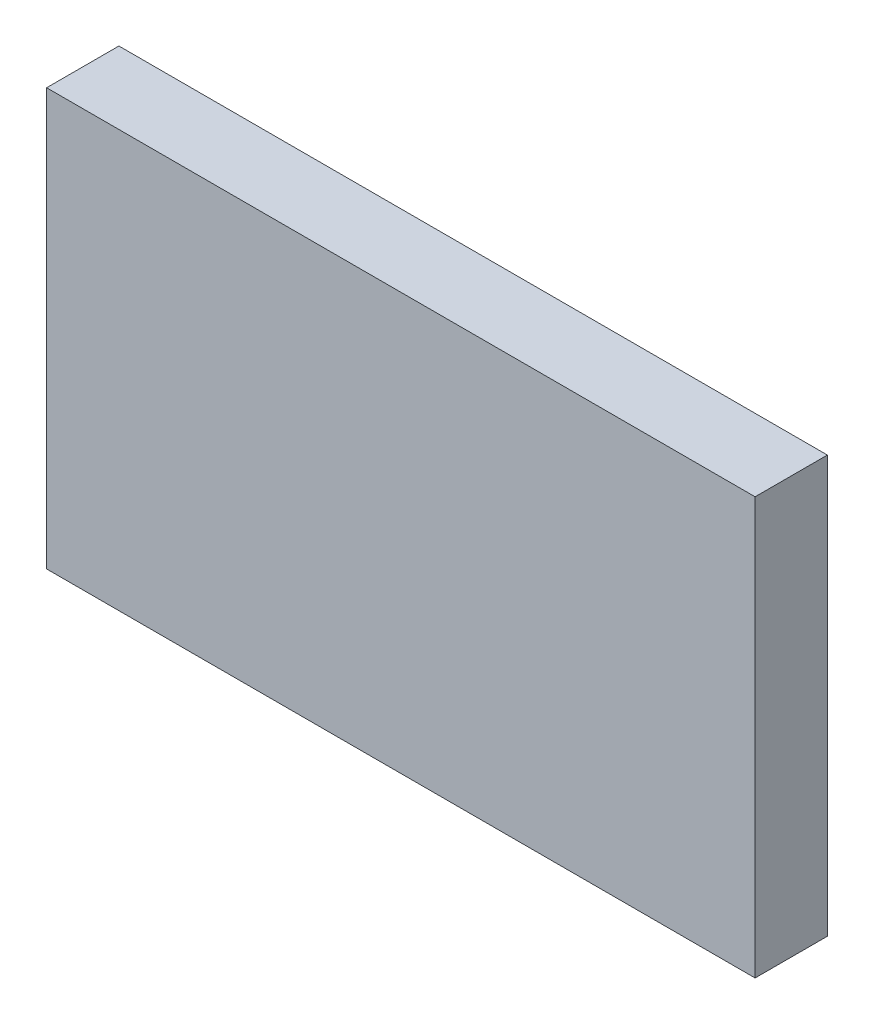
ISO-10303-21;
HEADER;
FILE_DESCRIPTION(('STEP AP214'),'2;1');
FILE_NAME('part.step','',(''),(''),'','','');
FILE_SCHEMA(('AUTOMOTIVE_DESIGN { 1 0 10303 214 1 1 1 1 }'));
ENDSEC;
DATA;
#1=APPLICATION_CONTEXT('core data for automotive mechanical design processes');
#2=APPLICATION_PROTOCOL_DEFINITION('international standard','automotive_design',2000,#1);
#3=PRODUCT_CONTEXT('',#1,'mechanical');
#4=PRODUCT('Part','Part','',(#3));
#5=PRODUCT_RELATED_PRODUCT_CATEGORY('part','',(#4));
#6=PRODUCT_DEFINITION_FORMATION('','',#4);
#7=PRODUCT_DEFINITION_CONTEXT('part definition',#1,'design');
#8=PRODUCT_DEFINITION('design','',#6,#7);
#9=PRODUCT_DEFINITION_SHAPE('','',#8);
#10=(LENGTH_UNIT() NAMED_UNIT(*) SI_UNIT(.MILLI.,.METRE.));
#11=(NAMED_UNIT(*) PLANE_ANGLE_UNIT() SI_UNIT($,.RADIAN.));
#12=(NAMED_UNIT(*) SI_UNIT($,.STERADIAN.) SOLID_ANGLE_UNIT());
#13=UNCERTAINTY_MEASURE_WITH_UNIT(LENGTH_MEASURE(1.E-05),#10,'distance_accuracy_value','');
#14=(GEOMETRIC_REPRESENTATION_CONTEXT(3) GLOBAL_UNCERTAINTY_ASSIGNED_CONTEXT((#13)) GLOBAL_UNIT_ASSIGNED_CONTEXT((#10,
#11,#12)) REPRESENTATION_CONTEXT('',''));
#15=CARTESIAN_POINT('',(0.,0.,0.));
#16=DIRECTION('',(0.,0.,1.));
#17=DIRECTION('',(1.,0.,0.));
#18=AXIS2_PLACEMENT_3D('',#15,#16,#17);
#19=CARTESIAN_POINT('',(-7.12169539547727,60.364846685474,10.));
#20=DIRECTION('',(-1.,0.,0.));
#21=DIRECTION('',(0.,0.,1.));
#22=AXIS2_PLACEMENT_3D('',#19,#20,#21);
#23=PLANE('',#22);
#24=DIRECTION('',(0.,1.,0.));
#25=VECTOR('',#24,1.);
#26=CARTESIAN_POINT('',(-7.12169539547727,60.364846685474,0.));
#27=LINE('',#26,#25);
#28=CARTESIAN_POINT('',(-7.12169539547727,2.71302681732467,0.));
#29=VERTEX_POINT('',#28);
#30=CARTESIAN_POINT('',(-7.12169539547727,60.364846685474,0.));
#31=VERTEX_POINT('',#30);
#32=EDGE_CURVE('E98',#29,#31,#27,.T.);
#33=ORIENTED_EDGE('',*,*,#32,.T.);
#34=DIRECTION('',(0.,0.,-1.));
#35=VECTOR('',#34,1.);
#36=CARTESIAN_POINT('',(-7.12169539547727,60.364846685474,10.));
#37=LINE('',#36,#35);
#38=CARTESIAN_POINT('',(-7.12169539547727,60.364846685474,10.));
#39=VERTEX_POINT('',#38);
#40=EDGE_CURVE('E11',#39,#31,#37,.T.);
#41=ORIENTED_EDGE('',*,*,#40,.F.);
#42=DIRECTION('',(0.,1.,0.));
#43=VECTOR('',#42,1.);
#44=CARTESIAN_POINT('',(-7.12169539547727,60.364846685474,10.));
#45=LINE('',#44,#43);
#46=CARTESIAN_POINT('',(-7.12169539547727,2.71302681732467,10.));
#47=VERTEX_POINT('',#46);
#48=EDGE_CURVE('E86',#47,#39,#45,.T.);
#49=ORIENTED_EDGE('',*,*,#48,.F.);
#50=DIRECTION('',(0.,0.,-1.));
#51=VECTOR('',#50,1.);
#52=CARTESIAN_POINT('',(-7.12169539547727,2.71302681732467,10.));
#53=LINE('',#52,#51);
#54=EDGE_CURVE('E94',#47,#29,#53,.T.);
#55=ORIENTED_EDGE('',*,*,#54,.T.);
#56=EDGE_LOOP('',(#33,#41,#49,#55));
#57=FACE_BOUND('',#56,.T.);
#58=ADVANCED_FACE('F35',(#57),#23,.F.);
#59=CARTESIAN_POINT('',(-105.129789171331,60.364846685474,10.));
#60=DIRECTION('',(0.,-1.,0.));
#61=DIRECTION('',(0.,0.,-1.));
#62=AXIS2_PLACEMENT_3D('',#59,#60,#61);
#63=PLANE('',#62);
#64=DIRECTION('',(-1.,0.,0.));
#65=VECTOR('',#64,1.);
#66=CARTESIAN_POINT('',(-105.129789171331,60.364846685474,0.));
#67=LINE('',#66,#65);
#68=CARTESIAN_POINT('',(-105.129789171331,60.364846685474,0.));
#69=VERTEX_POINT('',#68);
#70=EDGE_CURVE('E90',#31,#69,#67,.T.);
#71=ORIENTED_EDGE('',*,*,#70,.T.);
#72=DIRECTION('',(0.,0.,-1.));
#73=VECTOR('',#72,1.);
#74=CARTESIAN_POINT('',(-105.129789171331,60.364846685474,10.));
#75=LINE('',#74,#73);
#76=CARTESIAN_POINT('',(-105.129789171331,60.364846685474,10.));
#77=VERTEX_POINT('',#76);
#78=EDGE_CURVE('E43',#77,#69,#75,.T.);
#79=ORIENTED_EDGE('',*,*,#78,.F.);
#80=DIRECTION('',(-1.,0.,0.));
#81=VECTOR('',#80,1.);
#82=CARTESIAN_POINT('',(-105.129789171331,60.364846685474,10.));
#83=LINE('',#82,#81);
#84=EDGE_CURVE('E81',#39,#77,#83,.T.);
#85=ORIENTED_EDGE('',*,*,#84,.F.);
#86=ORIENTED_EDGE('',*,*,#40,.T.);
#87=EDGE_LOOP('',(#71,#79,#85,#86));
#88=FACE_BOUND('',#87,.T.);
#89=ADVANCED_FACE('F89',(#88),#63,.F.);
#90=CARTESIAN_POINT('',(-105.129789171331,60.364846685474,10.));
#91=DIRECTION('',(1.,0.,0.));
#92=DIRECTION('',(0.,0.,-1.));
#93=AXIS2_PLACEMENT_3D('',#90,#91,#92);
#94=PLANE('',#93);
#95=DIRECTION('',(0.,-1.,0.));
#96=VECTOR('',#95,1.);
#97=CARTESIAN_POINT('',(-105.129789171331,60.364846685474,0.));
#98=LINE('',#97,#96);
#99=CARTESIAN_POINT('',(-105.129789171331,2.71302681732467,0.));
#100=VERTEX_POINT('',#99);
#101=EDGE_CURVE('E68',#69,#100,#98,.T.);
#102=ORIENTED_EDGE('',*,*,#101,.T.);
#103=DIRECTION('',(0.,0.,-1.));
#104=VECTOR('',#103,1.);
#105=CARTESIAN_POINT('',(-105.129789171331,2.71302681732467,10.));
#106=LINE('',#105,#104);
#107=CARTESIAN_POINT('',(-105.129789171331,2.71302681732467,10.));
#108=VERTEX_POINT('',#107);
#109=EDGE_CURVE('E91',#108,#100,#106,.T.);
#110=ORIENTED_EDGE('',*,*,#109,.F.);
#111=DIRECTION('',(0.,-1.,0.));
#112=VECTOR('',#111,1.);
#113=CARTESIAN_POINT('',(-105.129789171331,60.364846685474,10.));
#114=LINE('',#113,#112);
#115=EDGE_CURVE('E84',#77,#108,#114,.T.);
#116=ORIENTED_EDGE('',*,*,#115,.F.);
#117=ORIENTED_EDGE('',*,*,#78,.T.);
#118=EDGE_LOOP('',(#102,#110,#116,#117));
#119=FACE_BOUND('',#118,.T.);
#120=ADVANCED_FACE('F92',(#119),#94,.F.);
#121=CARTESIAN_POINT('',(-105.129789171331,2.71302681732467,10.));
#122=DIRECTION('',(0.,1.,0.));
#123=DIRECTION('',(0.,0.,1.));
#124=AXIS2_PLACEMENT_3D('',#121,#122,#123);
#125=PLANE('',#124);
#126=DIRECTION('',(1.,0.,0.));
#127=VECTOR('',#126,1.);
#128=CARTESIAN_POINT('',(-105.129789171331,2.71302681732467,0.));
#129=LINE('',#128,#127);
#130=EDGE_CURVE('E74',#100,#29,#129,.T.);
#131=ORIENTED_EDGE('',*,*,#130,.T.);
#132=ORIENTED_EDGE('',*,*,#54,.F.);
#133=DIRECTION('',(1.,0.,0.));
#134=VECTOR('',#133,1.);
#135=CARTESIAN_POINT('',(-105.129789171331,2.71302681732467,10.));
#136=LINE('',#135,#134);
#137=EDGE_CURVE('E51',#108,#47,#136,.T.);
#138=ORIENTED_EDGE('',*,*,#137,.F.);
#139=ORIENTED_EDGE('',*,*,#109,.T.);
#140=EDGE_LOOP('',(#131,#132,#138,#139));
#141=FACE_BOUND('',#140,.T.);
#142=ADVANCED_FACE('F105',(#141),#125,.F.);
#143=CARTESIAN_POINT('',(0.,0.,10.));
#144=DIRECTION('',(0.,0.,1.));
#145=DIRECTION('',(1.,0.,0.));
#146=AXIS2_PLACEMENT_3D('',#143,#144,#145);
#147=PLANE('',#146);
#148=ORIENTED_EDGE('',*,*,#48,.T.);
#149=ORIENTED_EDGE('',*,*,#84,.T.);
#150=ORIENTED_EDGE('',*,*,#115,.T.);
#151=ORIENTED_EDGE('',*,*,#137,.T.);
#152=EDGE_LOOP('',(#148,#149,#150,#151));
#153=FACE_BOUND('',#152,.T.);
#154=ADVANCED_FACE('F82',(#153),#147,.T.);
#155=CARTESIAN_POINT('',(0.,0.,0.));
#156=DIRECTION('',(0.,0.,1.));
#157=DIRECTION('',(1.,0.,0.));
#158=AXIS2_PLACEMENT_3D('',#155,#156,#157);
#159=PLANE('',#158);
#160=ORIENTED_EDGE('',*,*,#32,.F.);
#161=ORIENTED_EDGE('',*,*,#130,.F.);
#162=ORIENTED_EDGE('',*,*,#101,.F.);
#163=ORIENTED_EDGE('',*,*,#70,.F.);
#164=EDGE_LOOP('',(#160,#161,#162,#163));
#165=FACE_BOUND('',#164,.T.);
#166=ADVANCED_FACE('F108',(#165),#159,.F.);
#167=CLOSED_SHELL('',(#58,#89,#120,#142,#154,#166));
#168=MANIFOLD_SOLID_BREP('B2',#167);
#169=ADVANCED_BREP_SHAPE_REPRESENTATION('',(#18,#168),#14);
#170=SHAPE_DEFINITION_REPRESENTATION(#9,#169);
ENDSEC;
END-ISO-10303-21;
